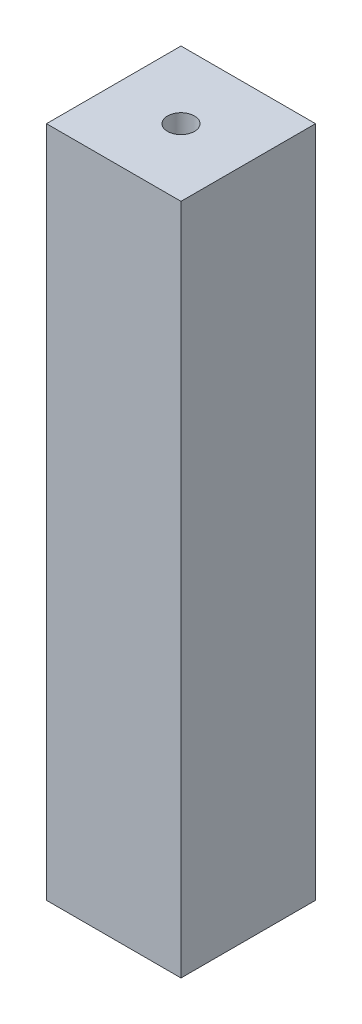
ISO-10303-21;
HEADER;
FILE_DESCRIPTION(('STEP AP214'),'2;1');
FILE_NAME('part.step','',(''),(''),'','','');
FILE_SCHEMA(('AUTOMOTIVE_DESIGN { 1 0 10303 214 1 1 1 1 }'));
ENDSEC;
DATA;
#1=APPLICATION_CONTEXT('core data for automotive mechanical design processes');
#2=APPLICATION_PROTOCOL_DEFINITION('international standard','automotive_design',2000,#1);
#3=PRODUCT_CONTEXT('',#1,'mechanical');
#4=PRODUCT('Part','Part','',(#3));
#5=PRODUCT_RELATED_PRODUCT_CATEGORY('part','',(#4));
#6=PRODUCT_DEFINITION_FORMATION('','',#4);
#7=PRODUCT_DEFINITION_CONTEXT('part definition',#1,'design');
#8=PRODUCT_DEFINITION('design','',#6,#7);
#9=PRODUCT_DEFINITION_SHAPE('','',#8);
#10=(LENGTH_UNIT() NAMED_UNIT(*) SI_UNIT(.MILLI.,.METRE.));
#11=(NAMED_UNIT(*) PLANE_ANGLE_UNIT() SI_UNIT($,.RADIAN.));
#12=(NAMED_UNIT(*) SI_UNIT($,.STERADIAN.) SOLID_ANGLE_UNIT());
#13=UNCERTAINTY_MEASURE_WITH_UNIT(LENGTH_MEASURE(1.E-05),#10,'distance_accuracy_value','');
#14=(GEOMETRIC_REPRESENTATION_CONTEXT(3) GLOBAL_UNCERTAINTY_ASSIGNED_CONTEXT((#13)) GLOBAL_UNIT_ASSIGNED_CONTEXT((#10,
#11,#12)) REPRESENTATION_CONTEXT('',''));
#15=CARTESIAN_POINT('',(0.,0.,0.));
#16=DIRECTION('',(0.,0.,1.));
#17=DIRECTION('',(1.,0.,0.));
#18=AXIS2_PLACEMENT_3D('',#15,#16,#17);
#19=CARTESIAN_POINT('',(0.,100.,0.));
#20=DIRECTION('',(1.,0.,0.));
#21=DIRECTION('',(0.,0.,-1.));
#22=AXIS2_PLACEMENT_3D('',#19,#20,#21);
#23=PLANE('',#22);
#24=DIRECTION('',(0.,0.,1.));
#25=VECTOR('',#24,1.);
#26=CARTESIAN_POINT('',(0.,0.,0.));
#27=LINE('',#26,#25);
#28=CARTESIAN_POINT('',(0.,0.,-20.));
#29=VERTEX_POINT('',#28);
#30=CARTESIAN_POINT('',(0.,0.,0.));
#31=VERTEX_POINT('',#30);
#32=EDGE_CURVE('E106',#29,#31,#27,.T.);
#33=ORIENTED_EDGE('',*,*,#32,.T.);
#34=DIRECTION('',(0.,-1.,0.));
#35=VECTOR('',#34,1.);
#36=CARTESIAN_POINT('',(0.,100.,0.));
#37=LINE('',#36,#35);
#38=CARTESIAN_POINT('',(0.,100.,0.));
#39=VERTEX_POINT('',#38);
#40=EDGE_CURVE('E11',#39,#31,#37,.T.);
#41=ORIENTED_EDGE('',*,*,#40,.F.);
#42=DIRECTION('',(0.,0.,1.));
#43=VECTOR('',#42,1.);
#44=CARTESIAN_POINT('',(0.,100.,0.));
#45=LINE('',#44,#43);
#46=CARTESIAN_POINT('',(0.,100.,-20.));
#47=VERTEX_POINT('',#46);
#48=EDGE_CURVE('E90',#47,#39,#45,.T.);
#49=ORIENTED_EDGE('',*,*,#48,.F.);
#50=DIRECTION('',(0.,-1.,0.));
#51=VECTOR('',#50,1.);
#52=CARTESIAN_POINT('',(0.,100.,-20.));
#53=LINE('',#52,#51);
#54=EDGE_CURVE('E102',#47,#29,#53,.T.);
#55=ORIENTED_EDGE('',*,*,#54,.T.);
#56=EDGE_LOOP('',(#33,#41,#49,#55));
#57=FACE_BOUND('',#56,.T.);
#58=ADVANCED_FACE('F38',(#57),#23,.F.);
#59=CARTESIAN_POINT('',(0.,100.,0.));
#60=DIRECTION('',(0.,0.,-1.));
#61=DIRECTION('',(-1.,0.,0.));
#62=AXIS2_PLACEMENT_3D('',#59,#60,#61);
#63=PLANE('',#62);
#64=DIRECTION('',(1.,0.,0.));
#65=VECTOR('',#64,1.);
#66=CARTESIAN_POINT('',(0.,0.,0.));
#67=LINE('',#66,#65);
#68=CARTESIAN_POINT('',(20.,0.,0.));
#69=VERTEX_POINT('',#68);
#70=EDGE_CURVE('E95',#31,#69,#67,.T.);
#71=ORIENTED_EDGE('',*,*,#70,.T.);
#72=DIRECTION('',(0.,-1.,0.));
#73=VECTOR('',#72,1.);
#74=CARTESIAN_POINT('',(20.,100.,0.));
#75=LINE('',#74,#73);
#76=CARTESIAN_POINT('',(20.,100.,0.));
#77=VERTEX_POINT('',#76);
#78=EDGE_CURVE('E47',#77,#69,#75,.T.);
#79=ORIENTED_EDGE('',*,*,#78,.F.);
#80=DIRECTION('',(1.,0.,0.));
#81=VECTOR('',#80,1.);
#82=CARTESIAN_POINT('',(0.,100.,0.));
#83=LINE('',#82,#81);
#84=EDGE_CURVE('E85',#39,#77,#83,.T.);
#85=ORIENTED_EDGE('',*,*,#84,.F.);
#86=ORIENTED_EDGE('',*,*,#40,.T.);
#87=EDGE_LOOP('',(#71,#79,#85,#86));
#88=FACE_BOUND('',#87,.T.);
#89=ADVANCED_FACE('F94',(#88),#63,.F.);
#90=CARTESIAN_POINT('',(20.,100.,0.));
#91=DIRECTION('',(-1.,0.,0.));
#92=DIRECTION('',(0.,0.,1.));
#93=AXIS2_PLACEMENT_3D('',#90,#91,#92);
#94=PLANE('',#93);
#95=DIRECTION('',(0.,0.,-1.));
#96=VECTOR('',#95,1.);
#97=CARTESIAN_POINT('',(20.,0.,0.));
#98=LINE('',#97,#96);
#99=CARTESIAN_POINT('',(20.,0.,-20.));
#100=VERTEX_POINT('',#99);
#101=EDGE_CURVE('E72',#69,#100,#98,.T.);
#102=ORIENTED_EDGE('',*,*,#101,.T.);
#103=DIRECTION('',(0.,-1.,0.));
#104=VECTOR('',#103,1.);
#105=CARTESIAN_POINT('',(20.,100.,-20.));
#106=LINE('',#105,#104);
#107=CARTESIAN_POINT('',(20.,100.,-20.));
#108=VERTEX_POINT('',#107);
#109=EDGE_CURVE('E97',#108,#100,#106,.T.);
#110=ORIENTED_EDGE('',*,*,#109,.F.);
#111=DIRECTION('',(0.,0.,-1.));
#112=VECTOR('',#111,1.);
#113=CARTESIAN_POINT('',(20.,100.,0.));
#114=LINE('',#113,#112);
#115=EDGE_CURVE('E88',#77,#108,#114,.T.);
#116=ORIENTED_EDGE('',*,*,#115,.F.);
#117=ORIENTED_EDGE('',*,*,#78,.T.);
#118=EDGE_LOOP('',(#102,#110,#116,#117));
#119=FACE_BOUND('',#118,.T.);
#120=ADVANCED_FACE('F98',(#119),#94,.F.);
#121=CARTESIAN_POINT('',(0.,100.,-20.));
#122=DIRECTION('',(0.,0.,1.));
#123=DIRECTION('',(1.,0.,0.));
#124=AXIS2_PLACEMENT_3D('',#121,#122,#123);
#125=PLANE('',#124);
#126=DIRECTION('',(-1.,0.,0.));
#127=VECTOR('',#126,1.);
#128=CARTESIAN_POINT('',(0.,0.,-20.));
#129=LINE('',#128,#127);
#130=EDGE_CURVE('E78',#100,#29,#129,.T.);
#131=ORIENTED_EDGE('',*,*,#130,.T.);
#132=ORIENTED_EDGE('',*,*,#54,.F.);
#133=DIRECTION('',(-1.,0.,0.));
#134=VECTOR('',#133,1.);
#135=CARTESIAN_POINT('',(0.,100.,-20.));
#136=LINE('',#135,#134);
#137=EDGE_CURVE('E55',#108,#47,#136,.T.);
#138=ORIENTED_EDGE('',*,*,#137,.F.);
#139=ORIENTED_EDGE('',*,*,#109,.T.);
#140=EDGE_LOOP('',(#131,#132,#138,#139));
#141=FACE_BOUND('',#140,.T.);
#142=ADVANCED_FACE('F120',(#141),#125,.F.);
#143=CARTESIAN_POINT('',(0.,100.,0.));
#144=DIRECTION('',(0.,-1.,0.));
#145=DIRECTION('',(0.,0.,-1.));
#146=AXIS2_PLACEMENT_3D('',#143,#144,#145);
#147=PLANE('',#146);
#148=CARTESIAN_POINT('',(10.,100.,-10.));
#149=DIRECTION('',(0.,1.,0.));
#150=DIRECTION('',(0.,0.,1.));
#151=AXIS2_PLACEMENT_3D('',#148,#149,#150);
#152=CIRCLE('',#151,2.);
#153=CARTESIAN_POINT('',(10.,100.,-8.));
#154=VERTEX_POINT('',#153);
#155=EDGE_CURVE('E127',#154,#154,#152,.T.);
#156=ORIENTED_EDGE('',*,*,#155,.F.);
#157=EDGE_LOOP('',(#156));
#158=FACE_BOUND('',#157,.T.);
#159=ORIENTED_EDGE('',*,*,#48,.T.);
#160=ORIENTED_EDGE('',*,*,#84,.T.);
#161=ORIENTED_EDGE('',*,*,#115,.T.);
#162=ORIENTED_EDGE('',*,*,#137,.T.);
#163=EDGE_LOOP('',(#159,#160,#161,#162));
#164=FACE_BOUND('',#163,.T.);
#165=ADVANCED_FACE('F86',(#158,#164),#147,.F.);
#166=CARTESIAN_POINT('',(0.,0.,0.));
#167=DIRECTION('',(0.,-1.,0.));
#168=DIRECTION('',(0.,0.,-1.));
#169=AXIS2_PLACEMENT_3D('',#166,#167,#168);
#170=PLANE('',#169);
#171=CARTESIAN_POINT('',(10.,0.,-10.));
#172=DIRECTION('',(0.,1.,0.));
#173=DIRECTION('',(0.,0.,1.));
#174=AXIS2_PLACEMENT_3D('',#171,#172,#173);
#175=CIRCLE('',#174,2.);
#176=CARTESIAN_POINT('',(10.,0.,-8.));
#177=VERTEX_POINT('',#176);
#178=EDGE_CURVE('E110',#177,#177,#175,.T.);
#179=ORIENTED_EDGE('',*,*,#178,.T.);
#180=EDGE_LOOP('',(#179));
#181=FACE_BOUND('',#180,.T.);
#182=ORIENTED_EDGE('',*,*,#32,.F.);
#183=ORIENTED_EDGE('',*,*,#130,.F.);
#184=ORIENTED_EDGE('',*,*,#101,.F.);
#185=ORIENTED_EDGE('',*,*,#70,.F.);
#186=EDGE_LOOP('',(#182,#183,#184,#185));
#187=FACE_BOUND('',#186,.T.);
#188=ADVANCED_FACE('F123',(#181,#187),#170,.T.);
#189=CARTESIAN_POINT('',(10.,0.,-10.));
#190=DIRECTION('',(0.,1.,0.));
#191=DIRECTION('',(0.,0.,1.));
#192=AXIS2_PLACEMENT_3D('',#189,#190,#191);
#193=CYLINDRICAL_SURFACE('',#192,2.);
#194=ORIENTED_EDGE('',*,*,#178,.F.);
#195=EDGE_LOOP('',(#194));
#196=FACE_BOUND('',#195,.T.);
#197=ORIENTED_EDGE('',*,*,#155,.T.);
#198=EDGE_LOOP('',(#197));
#199=FACE_BOUND('',#198,.T.);
#200=ADVANCED_FACE('F136',(#196,#199),#193,.F.);
#201=CLOSED_SHELL('',(#58,#89,#120,#142,#165,#188,#200));
#202=MANIFOLD_SOLID_BREP('B2',#201);
#203=ADVANCED_BREP_SHAPE_REPRESENTATION('',(#18,#202),#14);
#204=SHAPE_DEFINITION_REPRESENTATION(#9,#203);
ENDSEC;
END-ISO-10303-21;
